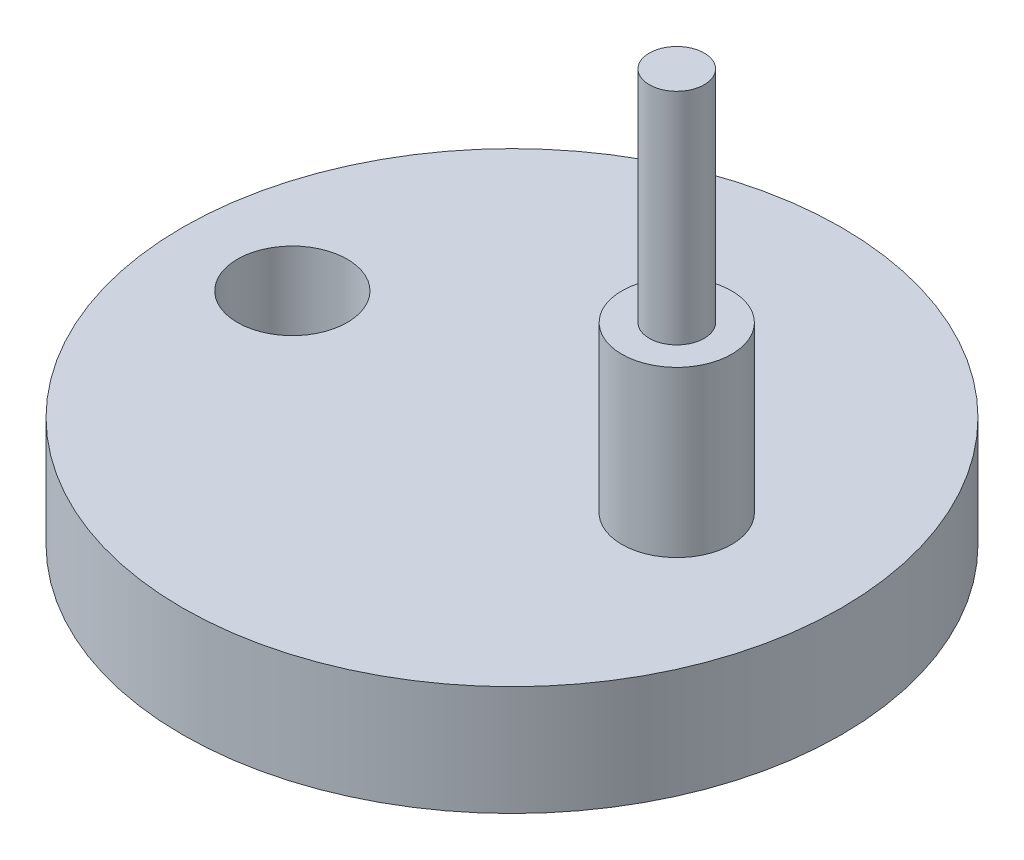
ISO-10303-21;
HEADER;
FILE_DESCRIPTION(('STEP AP214'),'2;1');
FILE_NAME('part.step','',(''),(''),'','','');
FILE_SCHEMA(('AUTOMOTIVE_DESIGN { 1 0 10303 214 1 1 1 1 }'));
ENDSEC;
DATA;
#1=APPLICATION_CONTEXT('core data for automotive mechanical design processes');
#2=APPLICATION_PROTOCOL_DEFINITION('international standard','automotive_design',2000,#1);
#3=PRODUCT_CONTEXT('',#1,'mechanical');
#4=PRODUCT('Part','Part','',(#3));
#5=PRODUCT_RELATED_PRODUCT_CATEGORY('part','',(#4));
#6=PRODUCT_DEFINITION_FORMATION('','',#4);
#7=PRODUCT_DEFINITION_CONTEXT('part definition',#1,'design');
#8=PRODUCT_DEFINITION('design','',#6,#7);
#9=PRODUCT_DEFINITION_SHAPE('','',#8);
#10=(LENGTH_UNIT() NAMED_UNIT(*) SI_UNIT(.MILLI.,.METRE.));
#11=(NAMED_UNIT(*) PLANE_ANGLE_UNIT() SI_UNIT($,.RADIAN.));
#12=(NAMED_UNIT(*) SI_UNIT($,.STERADIAN.) SOLID_ANGLE_UNIT());
#13=UNCERTAINTY_MEASURE_WITH_UNIT(LENGTH_MEASURE(1.E-05),#10,'distance_accuracy_value','');
#14=(GEOMETRIC_REPRESENTATION_CONTEXT(3) GLOBAL_UNCERTAINTY_ASSIGNED_CONTEXT((#13)) GLOBAL_UNIT_ASSIGNED_CONTEXT((#10,
#11,#12)) REPRESENTATION_CONTEXT('',''));
#15=CARTESIAN_POINT('',(0.,0.,0.));
#16=DIRECTION('',(0.,0.,1.));
#17=DIRECTION('',(1.,0.,0.));
#18=AXIS2_PLACEMENT_3D('',#15,#16,#17);
#19=CARTESIAN_POINT('',(0.,10.,0.));
#20=DIRECTION('',(0.,-1.,0.));
#21=DIRECTION('',(0.,0.,-1.));
#22=AXIS2_PLACEMENT_3D('',#19,#20,#21);
#23=CYLINDRICAL_SURFACE('',#22,30.);
#24=CARTESIAN_POINT('',(0.,10.,0.));
#25=DIRECTION('',(0.,1.,0.));
#26=DIRECTION('',(0.,0.,1.));
#27=AXIS2_PLACEMENT_3D('',#24,#25,#26);
#28=CIRCLE('',#27,30.);
#29=CARTESIAN_POINT('',(0.,10.,30.));
#30=VERTEX_POINT('',#29);
#31=EDGE_CURVE('E38',#30,#30,#28,.T.);
#32=ORIENTED_EDGE('',*,*,#31,.F.);
#33=EDGE_LOOP('',(#32));
#34=FACE_BOUND('',#33,.T.);
#35=CARTESIAN_POINT('',(0.,0.,0.));
#36=DIRECTION('',(0.,1.,0.));
#37=DIRECTION('',(0.,0.,1.));
#38=AXIS2_PLACEMENT_3D('',#35,#36,#37);
#39=CIRCLE('',#38,30.);
#40=CARTESIAN_POINT('',(0.,0.,30.));
#41=VERTEX_POINT('',#40);
#42=EDGE_CURVE('E43',#41,#41,#39,.T.);
#43=ORIENTED_EDGE('',*,*,#42,.T.);
#44=EDGE_LOOP('',(#43));
#45=FACE_BOUND('',#44,.T.);
#46=ADVANCED_FACE('F31',(#34,#45),#23,.T.);
#47=CARTESIAN_POINT('',(0.,10.,0.));
#48=DIRECTION('',(0.,1.,0.));
#49=DIRECTION('',(0.,0.,1.));
#50=AXIS2_PLACEMENT_3D('',#47,#48,#49);
#51=PLANE('',#50);
#52=CARTESIAN_POINT('',(-20.,10.,0.));
#53=DIRECTION('',(0.,1.,0.));
#54=DIRECTION('',(0.,0.,1.));
#55=AXIS2_PLACEMENT_3D('',#52,#53,#54);
#56=CIRCLE('',#55,5.);
#57=CARTESIAN_POINT('',(-20.,10.,5.));
#58=VERTEX_POINT('',#57);
#59=EDGE_CURVE('E143',#58,#58,#56,.T.);
#60=ORIENTED_EDGE('',*,*,#59,.F.);
#61=EDGE_LOOP('',(#60));
#62=FACE_BOUND('',#61,.T.);
#63=CARTESIAN_POINT('',(15.,10.,0.));
#64=DIRECTION('',(0.,1.,0.));
#65=DIRECTION('',(0.,0.,1.));
#66=AXIS2_PLACEMENT_3D('',#63,#64,#65);
#67=CIRCLE('',#66,5.);
#68=CARTESIAN_POINT('',(15.,10.,5.));
#69=VERTEX_POINT('',#68);
#70=EDGE_CURVE('E52',#69,#69,#67,.T.);
#71=ORIENTED_EDGE('',*,*,#70,.F.);
#72=EDGE_LOOP('',(#71));
#73=FACE_BOUND('',#72,.T.);
#74=ORIENTED_EDGE('',*,*,#31,.T.);
#75=EDGE_LOOP('',(#74));
#76=FACE_BOUND('',#75,.T.);
#77=ADVANCED_FACE('F61',(#62,#73,#76),#51,.T.);
#78=CARTESIAN_POINT('',(0.,0.,0.));
#79=DIRECTION('',(0.,1.,0.));
#80=DIRECTION('',(0.,0.,1.));
#81=AXIS2_PLACEMENT_3D('',#78,#79,#80);
#82=PLANE('',#81);
#83=CARTESIAN_POINT('',(-20.,0.,0.));
#84=DIRECTION('',(0.,1.,0.));
#85=DIRECTION('',(0.,0.,1.));
#86=AXIS2_PLACEMENT_3D('',#83,#84,#85);
#87=CIRCLE('',#86,5.);
#88=CARTESIAN_POINT('',(-20.,0.,5.));
#89=VERTEX_POINT('',#88);
#90=EDGE_CURVE('E34',#89,#89,#87,.T.);
#91=ORIENTED_EDGE('',*,*,#90,.T.);
#92=EDGE_LOOP('',(#91));
#93=FACE_BOUND('',#92,.T.);
#94=ORIENTED_EDGE('',*,*,#42,.F.);
#95=EDGE_LOOP('',(#94));
#96=FACE_BOUND('',#95,.T.);
#97=ADVANCED_FACE('F58',(#93,#96),#82,.F.);
#98=CARTESIAN_POINT('',(15.,25.,0.));
#99=DIRECTION('',(0.,-1.,0.));
#100=DIRECTION('',(0.,0.,-1.));
#101=AXIS2_PLACEMENT_3D('',#98,#99,#100);
#102=CYLINDRICAL_SURFACE('',#101,5.);
#103=CARTESIAN_POINT('',(15.,25.,0.));
#104=DIRECTION('',(0.,1.,0.));
#105=DIRECTION('',(0.,0.,1.));
#106=AXIS2_PLACEMENT_3D('',#103,#104,#105);
#107=CIRCLE('',#106,5.);
#108=CARTESIAN_POINT('',(15.,25.,5.));
#109=VERTEX_POINT('',#108);
#110=EDGE_CURVE('E49',#109,#109,#107,.T.);
#111=ORIENTED_EDGE('',*,*,#110,.F.);
#112=EDGE_LOOP('',(#111));
#113=FACE_BOUND('',#112,.T.);
#114=ORIENTED_EDGE('',*,*,#70,.T.);
#115=EDGE_LOOP('',(#114));
#116=FACE_BOUND('',#115,.T.);
#117=ADVANCED_FACE('F60',(#113,#116),#102,.T.);
#118=CARTESIAN_POINT('',(15.,25.,0.));
#119=DIRECTION('',(0.,1.,0.));
#120=DIRECTION('',(0.,0.,1.));
#121=AXIS2_PLACEMENT_3D('',#118,#119,#120);
#122=PLANE('',#121);
#123=CARTESIAN_POINT('',(15.,25.,0.));
#124=DIRECTION('',(0.,1.,0.));
#125=DIRECTION('',(0.,0.,1.));
#126=AXIS2_PLACEMENT_3D('',#123,#124,#125);
#127=CIRCLE('',#126,2.5);
#128=CARTESIAN_POINT('',(15.,25.,2.5));
#129=VERTEX_POINT('',#128);
#130=EDGE_CURVE('E10',#129,#129,#127,.T.);
#131=ORIENTED_EDGE('',*,*,#130,.F.);
#132=EDGE_LOOP('',(#131));
#133=FACE_BOUND('',#132,.T.);
#134=ORIENTED_EDGE('',*,*,#110,.T.);
#135=EDGE_LOOP('',(#134));
#136=FACE_BOUND('',#135,.T.);
#137=ADVANCED_FACE('F67',(#133,#136),#122,.T.);
#138=CARTESIAN_POINT('',(15.,45.,0.));
#139=DIRECTION('',(0.,-1.,0.));
#140=DIRECTION('',(0.,0.,-1.));
#141=AXIS2_PLACEMENT_3D('',#138,#139,#140);
#142=CYLINDRICAL_SURFACE('',#141,2.5);
#143=CARTESIAN_POINT('',(15.,45.,0.));
#144=DIRECTION('',(0.,1.,0.));
#145=DIRECTION('',(0.,0.,1.));
#146=AXIS2_PLACEMENT_3D('',#143,#144,#145);
#147=CIRCLE('',#146,2.5);
#148=CARTESIAN_POINT('',(15.,45.,2.5));
#149=VERTEX_POINT('',#148);
#150=EDGE_CURVE('E47',#149,#149,#147,.T.);
#151=ORIENTED_EDGE('',*,*,#150,.F.);
#152=EDGE_LOOP('',(#151));
#153=FACE_BOUND('',#152,.T.);
#154=ORIENTED_EDGE('',*,*,#130,.T.);
#155=EDGE_LOOP('',(#154));
#156=FACE_BOUND('',#155,.T.);
#157=ADVANCED_FACE('F111',(#153,#156),#142,.T.);
#158=CARTESIAN_POINT('',(15.,45.,0.));
#159=DIRECTION('',(0.,1.,0.));
#160=DIRECTION('',(0.,0.,1.));
#161=AXIS2_PLACEMENT_3D('',#158,#159,#160);
#162=PLANE('',#161);
#163=ORIENTED_EDGE('',*,*,#150,.T.);
#164=EDGE_LOOP('',(#163));
#165=FACE_BOUND('',#164,.T.);
#166=ADVANCED_FACE('F90',(#165),#162,.T.);
#167=CARTESIAN_POINT('',(-20.,-90.,0.));
#168=DIRECTION('',(0.,1.,0.));
#169=DIRECTION('',(0.,0.,1.));
#170=AXIS2_PLACEMENT_3D('',#167,#168,#169);
#171=CYLINDRICAL_SURFACE('',#170,5.);
#172=ORIENTED_EDGE('',*,*,#59,.T.);
#173=EDGE_LOOP('',(#172));
#174=FACE_BOUND('',#173,.T.);
#175=ORIENTED_EDGE('',*,*,#90,.F.);
#176=EDGE_LOOP('',(#175));
#177=FACE_BOUND('',#176,.T.);
#178=ADVANCED_FACE('F100',(#174,#177),#171,.F.);
#179=CLOSED_SHELL('',(#46,#77,#97,#117,#137,#157,#166,#178));
#180=MANIFOLD_SOLID_BREP('B2',#179);
#181=ADVANCED_BREP_SHAPE_REPRESENTATION('',(#18,#180),#14);
#182=SHAPE_DEFINITION_REPRESENTATION(#9,#181);
ENDSEC;
END-ISO-10303-21;
